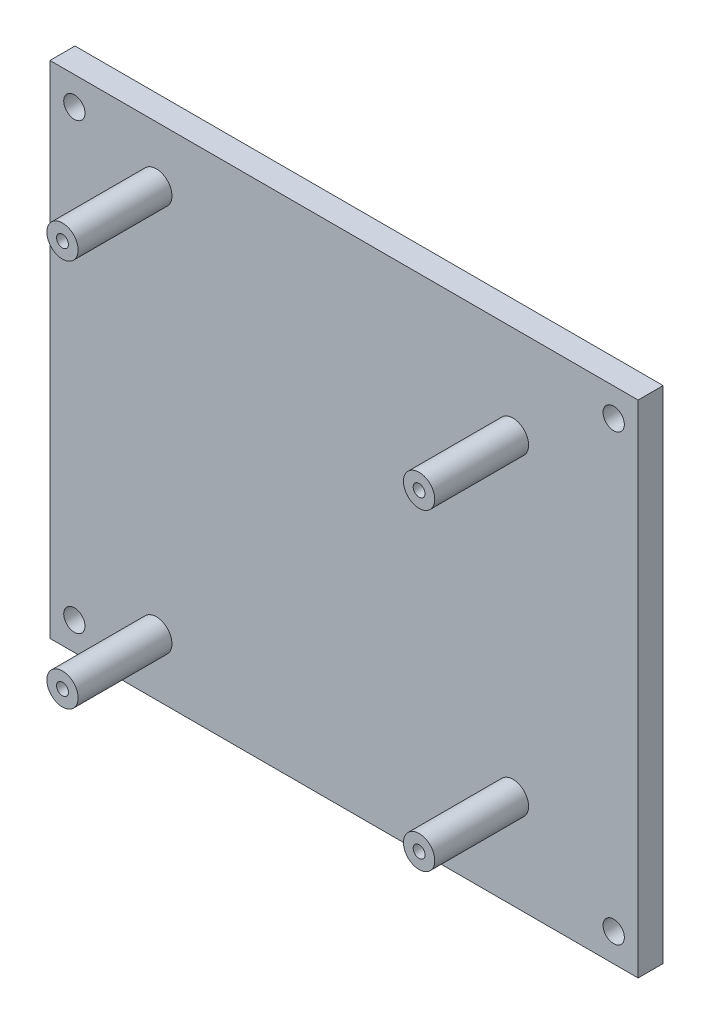
ISO-10303-21;
HEADER;
FILE_DESCRIPTION(('STEP AP214'),'2;1');
FILE_NAME('part.step','',(''),(''),'','','');
FILE_SCHEMA(('AUTOMOTIVE_DESIGN { 1 0 10303 214 1 1 1 1 }'));
ENDSEC;
DATA;
#1=APPLICATION_CONTEXT('core data for automotive mechanical design processes');
#2=APPLICATION_PROTOCOL_DEFINITION('international standard','automotive_design',2000,#1);
#3=PRODUCT_CONTEXT('',#1,'mechanical');
#4=PRODUCT('Part','Part','',(#3));
#5=PRODUCT_RELATED_PRODUCT_CATEGORY('part','',(#4));
#6=PRODUCT_DEFINITION_FORMATION('','',#4);
#7=PRODUCT_DEFINITION_CONTEXT('part definition',#1,'design');
#8=PRODUCT_DEFINITION('design','',#6,#7);
#9=PRODUCT_DEFINITION_SHAPE('','',#8);
#10=(LENGTH_UNIT() NAMED_UNIT(*) SI_UNIT(.MILLI.,.METRE.));
#11=(NAMED_UNIT(*) PLANE_ANGLE_UNIT() SI_UNIT($,.RADIAN.));
#12=(NAMED_UNIT(*) SI_UNIT($,.STERADIAN.) SOLID_ANGLE_UNIT());
#13=UNCERTAINTY_MEASURE_WITH_UNIT(LENGTH_MEASURE(1.E-05),#10,'distance_accuracy_value','');
#14=(GEOMETRIC_REPRESENTATION_CONTEXT(3) GLOBAL_UNCERTAINTY_ASSIGNED_CONTEXT((#13)) GLOBAL_UNIT_ASSIGNED_CONTEXT((#10,
#11,#12)) REPRESENTATION_CONTEXT('',''));
#15=CARTESIAN_POINT('',(0.,0.,0.));
#16=DIRECTION('',(0.,0.,1.));
#17=DIRECTION('',(1.,0.,0.));
#18=AXIS2_PLACEMENT_3D('',#15,#16,#17);
#19=CARTESIAN_POINT('',(47.,40.,4.));
#20=DIRECTION('',(-1.,0.,0.));
#21=DIRECTION('',(0.,0.,1.));
#22=AXIS2_PLACEMENT_3D('',#19,#20,#21);
#23=PLANE('',#22);
#24=DIRECTION('',(0.,1.,0.));
#25=VECTOR('',#24,1.);
#26=CARTESIAN_POINT('',(47.,40.,0.));
#27=LINE('',#26,#25);
#28=CARTESIAN_POINT('',(47.,-40.,0.));
#29=VERTEX_POINT('',#28);
#30=CARTESIAN_POINT('',(47.,40.,0.));
#31=VERTEX_POINT('',#30);
#32=EDGE_CURVE('E111',#29,#31,#27,.T.);
#33=ORIENTED_EDGE('',*,*,#32,.T.);
#34=DIRECTION('',(0.,0.,-1.));
#35=VECTOR('',#34,1.);
#36=CARTESIAN_POINT('',(47.,40.,4.));
#37=LINE('',#36,#35);
#38=CARTESIAN_POINT('',(47.,40.,4.));
#39=VERTEX_POINT('',#38);
#40=EDGE_CURVE('E11',#39,#31,#37,.T.);
#41=ORIENTED_EDGE('',*,*,#40,.F.);
#42=DIRECTION('',(0.,1.,0.));
#43=VECTOR('',#42,1.);
#44=CARTESIAN_POINT('',(47.,40.,4.));
#45=LINE('',#44,#43);
#46=CARTESIAN_POINT('',(47.,-40.,4.));
#47=VERTEX_POINT('',#46);
#48=EDGE_CURVE('E95',#47,#39,#45,.T.);
#49=ORIENTED_EDGE('',*,*,#48,.F.);
#50=DIRECTION('',(0.,0.,-1.));
#51=VECTOR('',#50,1.);
#52=CARTESIAN_POINT('',(47.,-40.,4.));
#53=LINE('',#52,#51);
#54=EDGE_CURVE('E107',#47,#29,#53,.T.);
#55=ORIENTED_EDGE('',*,*,#54,.T.);
#56=EDGE_LOOP('',(#33,#41,#49,#55));
#57=FACE_BOUND('',#56,.T.);
#58=ADVANCED_FACE('F43',(#57),#23,.F.);
#59=CARTESIAN_POINT('',(-47.,40.,4.));
#60=DIRECTION('',(0.,-1.,0.));
#61=DIRECTION('',(0.,0.,-1.));
#62=AXIS2_PLACEMENT_3D('',#59,#60,#61);
#63=PLANE('',#62);
#64=DIRECTION('',(-1.,0.,0.));
#65=VECTOR('',#64,1.);
#66=CARTESIAN_POINT('',(-47.,40.,0.));
#67=LINE('',#66,#65);
#68=CARTESIAN_POINT('',(-47.,40.,0.));
#69=VERTEX_POINT('',#68);
#70=EDGE_CURVE('E100',#31,#69,#67,.T.);
#71=ORIENTED_EDGE('',*,*,#70,.T.);
#72=DIRECTION('',(0.,0.,-1.));
#73=VECTOR('',#72,1.);
#74=CARTESIAN_POINT('',(-47.,40.,4.));
#75=LINE('',#74,#73);
#76=CARTESIAN_POINT('',(-47.,40.,4.));
#77=VERTEX_POINT('',#76);
#78=EDGE_CURVE('E52',#77,#69,#75,.T.);
#79=ORIENTED_EDGE('',*,*,#78,.F.);
#80=DIRECTION('',(-1.,0.,0.));
#81=VECTOR('',#80,1.);
#82=CARTESIAN_POINT('',(-47.,40.,4.));
#83=LINE('',#82,#81);
#84=EDGE_CURVE('E90',#39,#77,#83,.T.);
#85=ORIENTED_EDGE('',*,*,#84,.F.);
#86=ORIENTED_EDGE('',*,*,#40,.T.);
#87=EDGE_LOOP('',(#71,#79,#85,#86));
#88=FACE_BOUND('',#87,.T.);
#89=ADVANCED_FACE('F99',(#88),#63,.F.);
#90=CARTESIAN_POINT('',(-47.,40.,4.));
#91=DIRECTION('',(1.,0.,0.));
#92=DIRECTION('',(0.,0.,-1.));
#93=AXIS2_PLACEMENT_3D('',#90,#91,#92);
#94=PLANE('',#93);
#95=DIRECTION('',(0.,-1.,0.));
#96=VECTOR('',#95,1.);
#97=CARTESIAN_POINT('',(-47.,40.,0.));
#98=LINE('',#97,#96);
#99=CARTESIAN_POINT('',(-47.,-40.,0.));
#100=VERTEX_POINT('',#99);
#101=EDGE_CURVE('E77',#69,#100,#98,.T.);
#102=ORIENTED_EDGE('',*,*,#101,.T.);
#103=DIRECTION('',(0.,0.,-1.));
#104=VECTOR('',#103,1.);
#105=CARTESIAN_POINT('',(-47.,-40.,4.));
#106=LINE('',#105,#104);
#107=CARTESIAN_POINT('',(-47.,-40.,4.));
#108=VERTEX_POINT('',#107);
#109=EDGE_CURVE('E102',#108,#100,#106,.T.);
#110=ORIENTED_EDGE('',*,*,#109,.F.);
#111=DIRECTION('',(0.,-1.,0.));
#112=VECTOR('',#111,1.);
#113=CARTESIAN_POINT('',(-47.,40.,4.));
#114=LINE('',#113,#112);
#115=EDGE_CURVE('E93',#77,#108,#114,.T.);
#116=ORIENTED_EDGE('',*,*,#115,.F.);
#117=ORIENTED_EDGE('',*,*,#78,.T.);
#118=EDGE_LOOP('',(#102,#110,#116,#117));
#119=FACE_BOUND('',#118,.T.);
#120=ADVANCED_FACE('F103',(#119),#94,.F.);
#121=CARTESIAN_POINT('',(-47.,-40.,4.));
#122=DIRECTION('',(0.,1.,0.));
#123=DIRECTION('',(0.,0.,1.));
#124=AXIS2_PLACEMENT_3D('',#121,#122,#123);
#125=PLANE('',#124);
#126=DIRECTION('',(1.,0.,0.));
#127=VECTOR('',#126,1.);
#128=CARTESIAN_POINT('',(-47.,-40.,0.));
#129=LINE('',#128,#127);
#130=EDGE_CURVE('E83',#100,#29,#129,.T.);
#131=ORIENTED_EDGE('',*,*,#130,.T.);
#132=ORIENTED_EDGE('',*,*,#54,.F.);
#133=DIRECTION('',(1.,0.,0.));
#134=VECTOR('',#133,1.);
#135=CARTESIAN_POINT('',(-47.,-40.,4.));
#136=LINE('',#135,#134);
#137=EDGE_CURVE('E60',#108,#47,#136,.T.);
#138=ORIENTED_EDGE('',*,*,#137,.F.);
#139=ORIENTED_EDGE('',*,*,#109,.T.);
#140=EDGE_LOOP('',(#131,#132,#138,#139));
#141=FACE_BOUND('',#140,.T.);
#142=ADVANCED_FACE('F125',(#141),#125,.F.);
#143=CARTESIAN_POINT('',(0.,0.,4.));
#144=DIRECTION('',(0.,0.,1.));
#145=DIRECTION('',(1.,0.,0.));
#146=AXIS2_PLACEMENT_3D('',#143,#144,#145);
#147=PLANE('',#146);
#148=CARTESIAN_POINT('',(27.,-25.,4.));
#149=DIRECTION('',(0.,0.,1.));
#150=DIRECTION('',(1.,0.,0.));
#151=AXIS2_PLACEMENT_3D('',#148,#149,#150);
#152=CIRCLE('',#151,2.5);
#153=CARTESIAN_POINT('',(29.5,-25.,4.));
#154=VERTEX_POINT('',#153);
#155=EDGE_CURVE('E184',#154,#154,#152,.T.);
#156=ORIENTED_EDGE('',*,*,#155,.F.);
#157=EDGE_LOOP('',(#156));
#158=FACE_BOUND('',#157,.T.);
#159=CARTESIAN_POINT('',(27.,25.,4.));
#160=DIRECTION('',(0.,0.,1.));
#161=DIRECTION('',(1.,0.,0.));
#162=AXIS2_PLACEMENT_3D('',#159,#160,#161);
#163=CIRCLE('',#162,2.5);
#164=CARTESIAN_POINT('',(29.5,25.,4.));
#165=VERTEX_POINT('',#164);
#166=EDGE_CURVE('E176',#165,#165,#163,.T.);
#167=ORIENTED_EDGE('',*,*,#166,.F.);
#168=EDGE_LOOP('',(#167));
#169=FACE_BOUND('',#168,.T.);
#170=CARTESIAN_POINT('',(-30.,-31.,4.));
#171=DIRECTION('',(0.,0.,1.));
#172=DIRECTION('',(1.,0.,0.));
#173=AXIS2_PLACEMENT_3D('',#170,#171,#172);
#174=CIRCLE('',#173,2.5);
#175=CARTESIAN_POINT('',(-27.5,-31.,4.));
#176=VERTEX_POINT('',#175);
#177=EDGE_CURVE('E168',#176,#176,#174,.T.);
#178=ORIENTED_EDGE('',*,*,#177,.F.);
#179=EDGE_LOOP('',(#178));
#180=FACE_BOUND('',#179,.T.);
#181=CARTESIAN_POINT('',(-30.,31.,4.));
#182=DIRECTION('',(0.,0.,1.));
#183=DIRECTION('',(1.,0.,0.));
#184=AXIS2_PLACEMENT_3D('',#181,#182,#183);
#185=CIRCLE('',#184,2.5);
#186=CARTESIAN_POINT('',(-27.5,31.,4.));
#187=VERTEX_POINT('',#186);
#188=EDGE_CURVE('E164',#187,#187,#185,.T.);
#189=ORIENTED_EDGE('',*,*,#188,.F.);
#190=EDGE_LOOP('',(#189));
#191=FACE_BOUND('',#190,.T.);
#192=CARTESIAN_POINT('',(-43.1000000000002,35.5,4.));
#193=DIRECTION('',(0.,0.,1.));
#194=DIRECTION('',(1.,0.,0.));
#195=AXIS2_PLACEMENT_3D('',#192,#193,#194);
#196=CIRCLE('',#195,1.7);
#197=CARTESIAN_POINT('',(-41.4000000000002,35.5,4.));
#198=VERTEX_POINT('',#197);
#199=EDGE_CURVE('E140',#198,#198,#196,.T.);
#200=ORIENTED_EDGE('',*,*,#199,.F.);
#201=EDGE_LOOP('',(#200));
#202=FACE_BOUND('',#201,.T.);
#203=CARTESIAN_POINT('',(43.0999999999998,35.5,4.));
#204=DIRECTION('',(0.,0.,1.));
#205=DIRECTION('',(1.,0.,0.));
#206=AXIS2_PLACEMENT_3D('',#203,#204,#205);
#207=CIRCLE('',#206,1.7);
#208=CARTESIAN_POINT('',(44.7999999999997,35.5,4.));
#209=VERTEX_POINT('',#208);
#210=EDGE_CURVE('E150',#209,#209,#207,.T.);
#211=ORIENTED_EDGE('',*,*,#210,.F.);
#212=EDGE_LOOP('',(#211));
#213=FACE_BOUND('',#212,.T.);
#214=CARTESIAN_POINT('',(43.1,-35.5,4.));
#215=DIRECTION('',(0.,0.,1.));
#216=DIRECTION('',(1.,0.,0.));
#217=AXIS2_PLACEMENT_3D('',#214,#215,#216);
#218=CIRCLE('',#217,1.7);
#219=CARTESIAN_POINT('',(44.8,-35.5,4.));
#220=VERTEX_POINT('',#219);
#221=EDGE_CURVE('E139',#220,#220,#218,.T.);
#222=ORIENTED_EDGE('',*,*,#221,.F.);
#223=EDGE_LOOP('',(#222));
#224=FACE_BOUND('',#223,.T.);
#225=CARTESIAN_POINT('',(-43.1,-35.5,4.));
#226=DIRECTION('',(0.,0.,1.));
#227=DIRECTION('',(1.,0.,0.));
#228=AXIS2_PLACEMENT_3D('',#225,#226,#227);
#229=CIRCLE('',#228,1.7);
#230=CARTESIAN_POINT('',(-41.4,-35.5,4.));
#231=VERTEX_POINT('',#230);
#232=EDGE_CURVE('E135',#231,#231,#229,.T.);
#233=ORIENTED_EDGE('',*,*,#232,.F.);
#234=EDGE_LOOP('',(#233));
#235=FACE_BOUND('',#234,.T.);
#236=ORIENTED_EDGE('',*,*,#48,.T.);
#237=ORIENTED_EDGE('',*,*,#84,.T.);
#238=ORIENTED_EDGE('',*,*,#115,.T.);
#239=ORIENTED_EDGE('',*,*,#137,.T.);
#240=EDGE_LOOP('',(#236,#237,#238,#239));
#241=FACE_BOUND('',#240,.T.);
#242=ADVANCED_FACE('F91',(#158,#169,#180,#191,#202,#213,#224,#235,#241),#147,.T.);
#243=CARTESIAN_POINT('',(0.,0.,0.));
#244=DIRECTION('',(0.,0.,1.));
#245=DIRECTION('',(1.,0.,0.));
#246=AXIS2_PLACEMENT_3D('',#243,#244,#245);
#247=PLANE('',#246);
#248=CARTESIAN_POINT('',(-30.,31.,0.));
#249=DIRECTION('',(0.,0.,1.));
#250=DIRECTION('',(1.,0.,0.));
#251=AXIS2_PLACEMENT_3D('',#248,#249,#250);
#252=CIRCLE('',#251,0.950000000000001);
#253=CARTESIAN_POINT('',(-29.05,31.,0.));
#254=VERTEX_POINT('',#253);
#255=EDGE_CURVE('E192',#254,#254,#252,.F.);
#256=ORIENTED_EDGE('',*,*,#255,.F.);
#257=EDGE_LOOP('',(#256));
#258=FACE_BOUND('',#257,.T.);
#259=CARTESIAN_POINT('',(27.,-25.,0.));
#260=DIRECTION('',(0.,0.,1.));
#261=DIRECTION('',(1.,0.,0.));
#262=AXIS2_PLACEMENT_3D('',#259,#260,#261);
#263=CIRCLE('',#262,0.950000000000001);
#264=CARTESIAN_POINT('',(27.95,-25.,0.));
#265=VERTEX_POINT('',#264);
#266=EDGE_CURVE('E217',#265,#265,#263,.F.);
#267=ORIENTED_EDGE('',*,*,#266,.F.);
#268=EDGE_LOOP('',(#267));
#269=FACE_BOUND('',#268,.T.);
#270=CARTESIAN_POINT('',(-30.,-31.,0.));
#271=DIRECTION('',(0.,0.,1.));
#272=DIRECTION('',(1.,0.,0.));
#273=AXIS2_PLACEMENT_3D('',#270,#271,#272);
#274=CIRCLE('',#273,0.950000000000001);
#275=CARTESIAN_POINT('',(-29.05,-31.,0.));
#276=VERTEX_POINT('',#275);
#277=EDGE_CURVE('E201',#276,#276,#274,.F.);
#278=ORIENTED_EDGE('',*,*,#277,.F.);
#279=EDGE_LOOP('',(#278));
#280=FACE_BOUND('',#279,.T.);
#281=CARTESIAN_POINT('',(27.,25.,0.));
#282=DIRECTION('',(0.,0.,1.));
#283=DIRECTION('',(1.,0.,0.));
#284=AXIS2_PLACEMENT_3D('',#281,#282,#283);
#285=CIRCLE('',#284,0.950000000000001);
#286=CARTESIAN_POINT('',(27.95,25.,0.));
#287=VERTEX_POINT('',#286);
#288=EDGE_CURVE('E200',#287,#287,#285,.F.);
#289=ORIENTED_EDGE('',*,*,#288,.F.);
#290=EDGE_LOOP('',(#289));
#291=FACE_BOUND('',#290,.T.);
#292=CARTESIAN_POINT('',(-43.1000000000002,35.5,0.));
#293=DIRECTION('',(0.,0.,1.));
#294=DIRECTION('',(1.,0.,0.));
#295=AXIS2_PLACEMENT_3D('',#292,#293,#294);
#296=CIRCLE('',#295,1.7);
#297=CARTESIAN_POINT('',(-41.4000000000002,35.5,0.));
#298=VERTEX_POINT('',#297);
#299=EDGE_CURVE('E145',#298,#298,#296,.F.);
#300=ORIENTED_EDGE('',*,*,#299,.F.);
#301=EDGE_LOOP('',(#300));
#302=FACE_BOUND('',#301,.T.);
#303=CARTESIAN_POINT('',(43.0999999999998,35.5,0.));
#304=DIRECTION('',(0.,0.,1.));
#305=DIRECTION('',(1.,0.,0.));
#306=AXIS2_PLACEMENT_3D('',#303,#304,#305);
#307=CIRCLE('',#306,1.7);
#308=CARTESIAN_POINT('',(44.7999999999997,35.5,0.));
#309=VERTEX_POINT('',#308);
#310=EDGE_CURVE('E144',#309,#309,#307,.F.);
#311=ORIENTED_EDGE('',*,*,#310,.F.);
#312=EDGE_LOOP('',(#311));
#313=FACE_BOUND('',#312,.T.);
#314=CARTESIAN_POINT('',(43.1,-35.5,0.));
#315=DIRECTION('',(0.,0.,1.));
#316=DIRECTION('',(1.,0.,0.));
#317=AXIS2_PLACEMENT_3D('',#314,#315,#316);
#318=CIRCLE('',#317,1.7);
#319=CARTESIAN_POINT('',(44.8,-35.5,0.));
#320=VERTEX_POINT('',#319);
#321=EDGE_CURVE('E154',#320,#320,#318,.F.);
#322=ORIENTED_EDGE('',*,*,#321,.F.);
#323=EDGE_LOOP('',(#322));
#324=FACE_BOUND('',#323,.T.);
#325=CARTESIAN_POINT('',(-43.1,-35.5,0.));
#326=DIRECTION('',(0.,0.,1.));
#327=DIRECTION('',(1.,0.,0.));
#328=AXIS2_PLACEMENT_3D('',#325,#326,#327);
#329=CIRCLE('',#328,1.7);
#330=CARTESIAN_POINT('',(-41.4,-35.5,0.));
#331=VERTEX_POINT('',#330);
#332=EDGE_CURVE('E115',#331,#331,#329,.F.);
#333=ORIENTED_EDGE('',*,*,#332,.F.);
#334=EDGE_LOOP('',(#333));
#335=FACE_BOUND('',#334,.T.);
#336=ORIENTED_EDGE('',*,*,#32,.F.);
#337=ORIENTED_EDGE('',*,*,#130,.F.);
#338=ORIENTED_EDGE('',*,*,#101,.F.);
#339=ORIENTED_EDGE('',*,*,#70,.F.);
#340=EDGE_LOOP('',(#336,#337,#338,#339));
#341=FACE_BOUND('',#340,.T.);
#342=ADVANCED_FACE('F128',(#258,#269,#280,#291,#302,#313,#324,#335,#341),#247,.F.);
#343=CARTESIAN_POINT('',(-43.1,-35.5,-0.00100000000000013));
#344=DIRECTION('',(0.,0.,1.));
#345=DIRECTION('',(1.,0.,0.));
#346=AXIS2_PLACEMENT_3D('',#343,#344,#345);
#347=CYLINDRICAL_SURFACE('',#346,1.7);
#348=ORIENTED_EDGE('',*,*,#232,.T.);
#349=EDGE_LOOP('',(#348));
#350=FACE_BOUND('',#349,.T.);
#351=ORIENTED_EDGE('',*,*,#332,.T.);
#352=EDGE_LOOP('',(#351));
#353=FACE_BOUND('',#352,.T.);
#354=ADVANCED_FACE('F257',(#350,#353),#347,.F.);
#355=CARTESIAN_POINT('',(43.1,-35.5,-0.00100000000000013));
#356=DIRECTION('',(0.,0.,1.));
#357=DIRECTION('',(1.,0.,0.));
#358=AXIS2_PLACEMENT_3D('',#355,#356,#357);
#359=CYLINDRICAL_SURFACE('',#358,1.7);
#360=ORIENTED_EDGE('',*,*,#221,.T.);
#361=EDGE_LOOP('',(#360));
#362=FACE_BOUND('',#361,.T.);
#363=ORIENTED_EDGE('',*,*,#321,.T.);
#364=EDGE_LOOP('',(#363));
#365=FACE_BOUND('',#364,.T.);
#366=ADVANCED_FACE('F260',(#362,#365),#359,.F.);
#367=CARTESIAN_POINT('',(43.0999999999998,35.5,-0.00100000000000013));
#368=DIRECTION('',(0.,0.,1.));
#369=DIRECTION('',(1.,0.,0.));
#370=AXIS2_PLACEMENT_3D('',#367,#368,#369);
#371=CYLINDRICAL_SURFACE('',#370,1.7);
#372=ORIENTED_EDGE('',*,*,#210,.T.);
#373=EDGE_LOOP('',(#372));
#374=FACE_BOUND('',#373,.T.);
#375=ORIENTED_EDGE('',*,*,#310,.T.);
#376=EDGE_LOOP('',(#375));
#377=FACE_BOUND('',#376,.T.);
#378=ADVANCED_FACE('F311',(#374,#377),#371,.F.);
#379=CARTESIAN_POINT('',(-43.1000000000002,35.5,-0.00100000000000013));
#380=DIRECTION('',(0.,0.,1.));
#381=DIRECTION('',(1.,0.,0.));
#382=AXIS2_PLACEMENT_3D('',#379,#380,#381);
#383=CYLINDRICAL_SURFACE('',#382,1.7);
#384=ORIENTED_EDGE('',*,*,#199,.T.);
#385=EDGE_LOOP('',(#384));
#386=FACE_BOUND('',#385,.T.);
#387=ORIENTED_EDGE('',*,*,#299,.T.);
#388=EDGE_LOOP('',(#387));
#389=FACE_BOUND('',#388,.T.);
#390=ADVANCED_FACE('F241',(#386,#389),#383,.F.);
#391=CARTESIAN_POINT('',(-30.,31.,19.));
#392=DIRECTION('',(0.,0.,-1.));
#393=DIRECTION('',(-1.,0.,0.));
#394=AXIS2_PLACEMENT_3D('',#391,#392,#393);
#395=CYLINDRICAL_SURFACE('',#394,2.5);
#396=CARTESIAN_POINT('',(-30.,31.,19.));
#397=DIRECTION('',(0.,0.,1.));
#398=DIRECTION('',(1.,0.,0.));
#399=AXIS2_PLACEMENT_3D('',#396,#397,#398);
#400=CIRCLE('',#399,2.5);
#401=CARTESIAN_POINT('',(-27.5,31.,19.));
#402=VERTEX_POINT('',#401);
#403=EDGE_CURVE('E149',#402,#402,#400,.T.);
#404=ORIENTED_EDGE('',*,*,#403,.F.);
#405=EDGE_LOOP('',(#404));
#406=FACE_BOUND('',#405,.T.);
#407=ORIENTED_EDGE('',*,*,#188,.T.);
#408=EDGE_LOOP('',(#407));
#409=FACE_BOUND('',#408,.T.);
#410=ADVANCED_FACE('F235',(#406,#409),#395,.T.);
#411=CARTESIAN_POINT('',(-30.,31.,19.));
#412=DIRECTION('',(0.,0.,1.));
#413=DIRECTION('',(1.,0.,0.));
#414=AXIS2_PLACEMENT_3D('',#411,#412,#413);
#415=PLANE('',#414);
#416=CARTESIAN_POINT('',(-30.,31.,19.));
#417=DIRECTION('',(0.,0.,1.));
#418=DIRECTION('',(1.,0.,0.));
#419=AXIS2_PLACEMENT_3D('',#416,#417,#418);
#420=CIRCLE('',#419,0.950000000000001);
#421=CARTESIAN_POINT('',(-29.05,31.,19.));
#422=VERTEX_POINT('',#421);
#423=EDGE_CURVE('E210',#422,#422,#420,.T.);
#424=ORIENTED_EDGE('',*,*,#423,.F.);
#425=EDGE_LOOP('',(#424));
#426=FACE_BOUND('',#425,.T.);
#427=ORIENTED_EDGE('',*,*,#403,.T.);
#428=EDGE_LOOP('',(#427));
#429=FACE_BOUND('',#428,.T.);
#430=ADVANCED_FACE('F231',(#426,#429),#415,.T.);
#431=CARTESIAN_POINT('',(-30.,-31.,19.));
#432=DIRECTION('',(0.,0.,-1.));
#433=DIRECTION('',(-1.,0.,0.));
#434=AXIS2_PLACEMENT_3D('',#431,#432,#433);
#435=CYLINDRICAL_SURFACE('',#434,2.5);
#436=CARTESIAN_POINT('',(-30.,-31.,19.));
#437=DIRECTION('',(0.,0.,1.));
#438=DIRECTION('',(1.,0.,0.));
#439=AXIS2_PLACEMENT_3D('',#436,#437,#438);
#440=CIRCLE('',#439,2.5);
#441=CARTESIAN_POINT('',(-27.5,-31.,19.));
#442=VERTEX_POINT('',#441);
#443=EDGE_CURVE('E172',#442,#442,#440,.T.);
#444=ORIENTED_EDGE('',*,*,#443,.F.);
#445=EDGE_LOOP('',(#444));
#446=FACE_BOUND('',#445,.T.);
#447=ORIENTED_EDGE('',*,*,#177,.T.);
#448=EDGE_LOOP('',(#447));
#449=FACE_BOUND('',#448,.T.);
#450=ADVANCED_FACE('F234',(#446,#449),#435,.T.);
#451=CARTESIAN_POINT('',(-30.,-31.,19.));
#452=DIRECTION('',(0.,0.,1.));
#453=DIRECTION('',(1.,0.,0.));
#454=AXIS2_PLACEMENT_3D('',#451,#452,#453);
#455=PLANE('',#454);
#456=CARTESIAN_POINT('',(-30.,-31.,19.));
#457=DIRECTION('',(0.,0.,1.));
#458=DIRECTION('',(1.,0.,0.));
#459=AXIS2_PLACEMENT_3D('',#456,#457,#458);
#460=CIRCLE('',#459,0.950000000000001);
#461=CARTESIAN_POINT('',(-29.05,-31.,19.));
#462=VERTEX_POINT('',#461);
#463=EDGE_CURVE('E196',#462,#462,#460,.T.);
#464=ORIENTED_EDGE('',*,*,#463,.F.);
#465=EDGE_LOOP('',(#464));
#466=FACE_BOUND('',#465,.T.);
#467=ORIENTED_EDGE('',*,*,#443,.T.);
#468=EDGE_LOOP('',(#467));
#469=FACE_BOUND('',#468,.T.);
#470=ADVANCED_FACE('F339',(#466,#469),#455,.T.);
#471=CARTESIAN_POINT('',(27.,25.,19.));
#472=DIRECTION('',(0.,0.,-1.));
#473=DIRECTION('',(-1.,0.,0.));
#474=AXIS2_PLACEMENT_3D('',#471,#472,#473);
#475=CYLINDRICAL_SURFACE('',#474,2.5);
#476=CARTESIAN_POINT('',(27.,25.,19.));
#477=DIRECTION('',(0.,0.,1.));
#478=DIRECTION('',(1.,0.,0.));
#479=AXIS2_PLACEMENT_3D('',#476,#477,#478);
#480=CIRCLE('',#479,2.5);
#481=CARTESIAN_POINT('',(29.5,25.,19.));
#482=VERTEX_POINT('',#481);
#483=EDGE_CURVE('E180',#482,#482,#480,.T.);
#484=ORIENTED_EDGE('',*,*,#483,.F.);
#485=EDGE_LOOP('',(#484));
#486=FACE_BOUND('',#485,.T.);
#487=ORIENTED_EDGE('',*,*,#166,.T.);
#488=EDGE_LOOP('',(#487));
#489=FACE_BOUND('',#488,.T.);
#490=ADVANCED_FACE('F347',(#486,#489),#475,.T.);
#491=CARTESIAN_POINT('',(27.,25.,19.));
#492=DIRECTION('',(0.,0.,1.));
#493=DIRECTION('',(1.,0.,0.));
#494=AXIS2_PLACEMENT_3D('',#491,#492,#493);
#495=PLANE('',#494);
#496=CARTESIAN_POINT('',(27.,25.,19.));
#497=DIRECTION('',(0.,0.,1.));
#498=DIRECTION('',(1.,0.,0.));
#499=AXIS2_PLACEMENT_3D('',#496,#497,#498);
#500=CIRCLE('',#499,0.950000000000001);
#501=CARTESIAN_POINT('',(27.95,25.,19.));
#502=VERTEX_POINT('',#501);
#503=EDGE_CURVE('E206',#502,#502,#500,.T.);
#504=ORIENTED_EDGE('',*,*,#503,.F.);
#505=EDGE_LOOP('',(#504));
#506=FACE_BOUND('',#505,.T.);
#507=ORIENTED_EDGE('',*,*,#483,.T.);
#508=EDGE_LOOP('',(#507));
#509=FACE_BOUND('',#508,.T.);
#510=ADVANCED_FACE('F355',(#506,#509),#495,.T.);
#511=CARTESIAN_POINT('',(27.,-25.,19.));
#512=DIRECTION('',(0.,0.,-1.));
#513=DIRECTION('',(-1.,0.,0.));
#514=AXIS2_PLACEMENT_3D('',#511,#512,#513);
#515=CYLINDRICAL_SURFACE('',#514,2.5);
#516=CARTESIAN_POINT('',(27.,-25.,19.));
#517=DIRECTION('',(0.,0.,1.));
#518=DIRECTION('',(1.,0.,0.));
#519=AXIS2_PLACEMENT_3D('',#516,#517,#518);
#520=CIRCLE('',#519,2.5);
#521=CARTESIAN_POINT('',(29.5,-25.,19.));
#522=VERTEX_POINT('',#521);
#523=EDGE_CURVE('E188',#522,#522,#520,.T.);
#524=ORIENTED_EDGE('',*,*,#523,.F.);
#525=EDGE_LOOP('',(#524));
#526=FACE_BOUND('',#525,.T.);
#527=ORIENTED_EDGE('',*,*,#155,.T.);
#528=EDGE_LOOP('',(#527));
#529=FACE_BOUND('',#528,.T.);
#530=ADVANCED_FACE('F362',(#526,#529),#515,.T.);
#531=CARTESIAN_POINT('',(27.,-25.,19.));
#532=DIRECTION('',(0.,0.,1.));
#533=DIRECTION('',(1.,0.,0.));
#534=AXIS2_PLACEMENT_3D('',#531,#532,#533);
#535=PLANE('',#534);
#536=CARTESIAN_POINT('',(27.,-25.,19.));
#537=DIRECTION('',(0.,0.,1.));
#538=DIRECTION('',(1.,0.,0.));
#539=AXIS2_PLACEMENT_3D('',#536,#537,#538);
#540=CIRCLE('',#539,0.950000000000001);
#541=CARTESIAN_POINT('',(27.95,-25.,19.));
#542=VERTEX_POINT('',#541);
#543=EDGE_CURVE('E205',#542,#542,#540,.T.);
#544=ORIENTED_EDGE('',*,*,#543,.F.);
#545=EDGE_LOOP('',(#544));
#546=FACE_BOUND('',#545,.T.);
#547=ORIENTED_EDGE('',*,*,#523,.T.);
#548=EDGE_LOOP('',(#547));
#549=FACE_BOUND('',#548,.T.);
#550=ADVANCED_FACE('F370',(#546,#549),#535,.T.);
#551=CARTESIAN_POINT('',(27.,-25.,-0.001000000000001));
#552=DIRECTION('',(0.,0.,1.));
#553=DIRECTION('',(1.,0.,0.));
#554=AXIS2_PLACEMENT_3D('',#551,#552,#553);
#555=CYLINDRICAL_SURFACE('',#554,0.950000000000001);
#556=ORIENTED_EDGE('',*,*,#543,.T.);
#557=EDGE_LOOP('',(#556));
#558=FACE_BOUND('',#557,.T.);
#559=ORIENTED_EDGE('',*,*,#266,.T.);
#560=EDGE_LOOP('',(#559));
#561=FACE_BOUND('',#560,.T.);
#562=ADVANCED_FACE('F377',(#558,#561),#555,.F.);
#563=CARTESIAN_POINT('',(27.,25.,-0.001000000000001));
#564=DIRECTION('',(0.,0.,1.));
#565=DIRECTION('',(1.,0.,0.));
#566=AXIS2_PLACEMENT_3D('',#563,#564,#565);
#567=CYLINDRICAL_SURFACE('',#566,0.950000000000001);
#568=ORIENTED_EDGE('',*,*,#503,.T.);
#569=EDGE_LOOP('',(#568));
#570=FACE_BOUND('',#569,.T.);
#571=ORIENTED_EDGE('',*,*,#288,.T.);
#572=EDGE_LOOP('',(#571));
#573=FACE_BOUND('',#572,.T.);
#574=ADVANCED_FACE('F385',(#570,#573),#567,.F.);
#575=CARTESIAN_POINT('',(-30.,-31.,-0.001000000000001));
#576=DIRECTION('',(0.,0.,1.));
#577=DIRECTION('',(1.,0.,0.));
#578=AXIS2_PLACEMENT_3D('',#575,#576,#577);
#579=CYLINDRICAL_SURFACE('',#578,0.950000000000001);
#580=ORIENTED_EDGE('',*,*,#463,.T.);
#581=EDGE_LOOP('',(#580));
#582=FACE_BOUND('',#581,.T.);
#583=ORIENTED_EDGE('',*,*,#277,.T.);
#584=EDGE_LOOP('',(#583));
#585=FACE_BOUND('',#584,.T.);
#586=ADVANCED_FACE('F393',(#582,#585),#579,.F.);
#587=CARTESIAN_POINT('',(-30.,31.,-0.001000000000001));
#588=DIRECTION('',(0.,0.,1.));
#589=DIRECTION('',(1.,0.,0.));
#590=AXIS2_PLACEMENT_3D('',#587,#588,#589);
#591=CYLINDRICAL_SURFACE('',#590,0.950000000000001);
#592=ORIENTED_EDGE('',*,*,#423,.T.);
#593=EDGE_LOOP('',(#592));
#594=FACE_BOUND('',#593,.T.);
#595=ORIENTED_EDGE('',*,*,#255,.T.);
#596=EDGE_LOOP('',(#595));
#597=FACE_BOUND('',#596,.T.);
#598=ADVANCED_FACE('F228',(#594,#597),#591,.F.);
#599=CLOSED_SHELL('',(#58,#89,#120,#142,#242,#342,#354,#366,#378,#390,#410,#430,#450,#470,#490,
#510,#530,#550,#562,#574,#586,#598));
#600=MANIFOLD_SOLID_BREP('B2',#599);
#601=ADVANCED_BREP_SHAPE_REPRESENTATION('',(#18,#600),#14);
#602=SHAPE_DEFINITION_REPRESENTATION(#9,#601);
ENDSEC;
END-ISO-10303-21;
